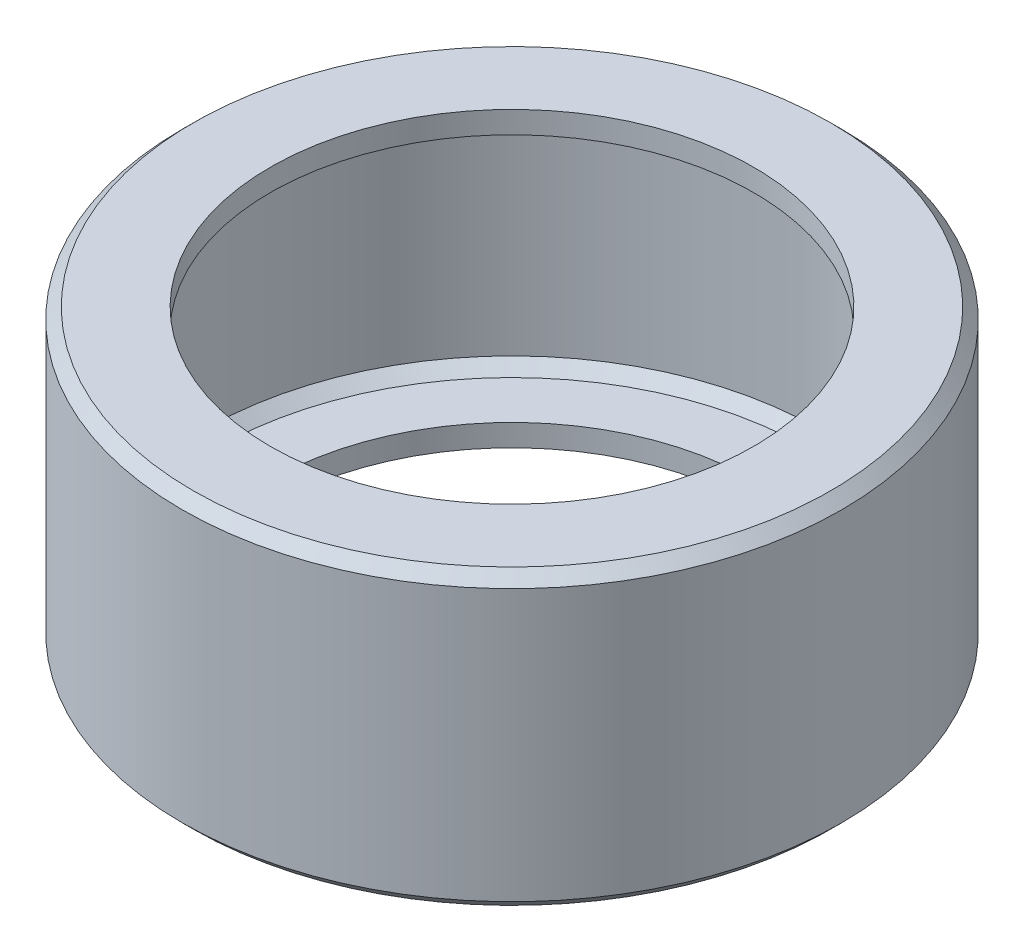
ISO-10303-21;
HEADER;
FILE_DESCRIPTION(('STEP AP214'),'2;1');
FILE_NAME('part.step','',(''),(''),'','','');
FILE_SCHEMA(('AUTOMOTIVE_DESIGN { 1 0 10303 214 1 1 1 1 }'));
ENDSEC;
DATA;
#1=APPLICATION_CONTEXT('core data for automotive mechanical design processes');
#2=APPLICATION_PROTOCOL_DEFINITION('international standard','automotive_design',2000,#1);
#3=PRODUCT_CONTEXT('',#1,'mechanical');
#4=PRODUCT('Part','Part','',(#3));
#5=PRODUCT_RELATED_PRODUCT_CATEGORY('part','',(#4));
#6=PRODUCT_DEFINITION_FORMATION('','',#4);
#7=PRODUCT_DEFINITION_CONTEXT('part definition',#1,'design');
#8=PRODUCT_DEFINITION('design','',#6,#7);
#9=PRODUCT_DEFINITION_SHAPE('','',#8);
#10=(LENGTH_UNIT() NAMED_UNIT(*) SI_UNIT(.MILLI.,.METRE.));
#11=(NAMED_UNIT(*) PLANE_ANGLE_UNIT() SI_UNIT($,.RADIAN.));
#12=(NAMED_UNIT(*) SI_UNIT($,.STERADIAN.) SOLID_ANGLE_UNIT());
#13=UNCERTAINTY_MEASURE_WITH_UNIT(LENGTH_MEASURE(1.E-05),#10,'distance_accuracy_value','');
#14=(GEOMETRIC_REPRESENTATION_CONTEXT(3) GLOBAL_UNCERTAINTY_ASSIGNED_CONTEXT((#13)) GLOBAL_UNIT_ASSIGNED_CONTEXT((#10,
#11,#12)) REPRESENTATION_CONTEXT('',''));
#15=CARTESIAN_POINT('',(0.,0.,0.));
#16=DIRECTION('',(0.,0.,1.));
#17=DIRECTION('',(1.,0.,0.));
#18=AXIS2_PLACEMENT_3D('',#15,#16,#17);
#19=CARTESIAN_POINT('',(0.,1.7,0.));
#20=DIRECTION('',(0.,-1.,0.));
#21=DIRECTION('',(0.,0.,-1.));
#22=AXIS2_PLACEMENT_3D('',#19,#20,#21);
#23=CYLINDRICAL_SURFACE('',#22,4.5);
#24=CARTESIAN_POINT('',(0.,1.85,0.));
#25=DIRECTION('',(0.,1.,0.));
#26=DIRECTION('',(0.,0.,1.));
#27=AXIS2_PLACEMENT_3D('',#24,#25,#26);
#28=CIRCLE('',#27,4.5);
#29=CARTESIAN_POINT('',(0.,1.85,4.5));
#30=VERTEX_POINT('',#29);
#31=EDGE_CURVE('E43',#30,#30,#28,.F.);
#32=ORIENTED_EDGE('',*,*,#31,.T.);
#33=EDGE_LOOP('',(#32));
#34=FACE_BOUND('',#33,.T.);
#35=CARTESIAN_POINT('',(0.,-1.85,0.));
#36=DIRECTION('',(0.,1.,0.));
#37=DIRECTION('',(0.,0.,1.));
#38=AXIS2_PLACEMENT_3D('',#35,#36,#37);
#39=CIRCLE('',#38,4.5);
#40=CARTESIAN_POINT('',(0.,-1.85,4.5));
#41=VERTEX_POINT('',#40);
#42=EDGE_CURVE('E64',#41,#41,#39,.F.);
#43=ORIENTED_EDGE('',*,*,#42,.F.);
#44=EDGE_LOOP('',(#43));
#45=FACE_BOUND('',#44,.T.);
#46=ADVANCED_FACE('F32',(#34,#45),#23,.T.);
#47=CARTESIAN_POINT('',(0.,1.7,0.));
#48=DIRECTION('',(0.,-1.,0.));
#49=DIRECTION('',(0.,0.,-1.));
#50=AXIS2_PLACEMENT_3D('',#47,#48,#49);
#51=CYLINDRICAL_SURFACE('',#50,4.2);
#52=CARTESIAN_POINT('',(0.,1.55,0.));
#53=DIRECTION('',(0.,1.,0.));
#54=DIRECTION('',(0.,0.,1.));
#55=AXIS2_PLACEMENT_3D('',#52,#53,#54);
#56=CIRCLE('',#55,4.2);
#57=CARTESIAN_POINT('',(0.,1.55,-4.2));
#58=VERTEX_POINT('',#57);
#59=EDGE_CURVE('E39',#58,#58,#56,.T.);
#60=CARTESIAN_POINT('',(0.,-1.55,0.));
#61=DIRECTION('',(0.,1.,0.));
#62=DIRECTION('',(0.,0.,1.));
#63=AXIS2_PLACEMENT_3D('',#60,#61,#62);
#64=CIRCLE('',#63,4.2);
#65=CARTESIAN_POINT('',(0.,-1.55,-4.2));
#66=VERTEX_POINT('',#65);
#67=EDGE_CURVE('E61',#66,#66,#64,.T.);
#68=CARTESIAN_POINT('',(0.,1.55,-4.2));
#69=CARTESIAN_POINT('',(0.,1.51770833333333,-4.2));
#70=CARTESIAN_POINT('',(0.,1.48541666666666,-4.2));
#71=CARTESIAN_POINT('',(0.,1.42083333333333,-4.2));
#72=CARTESIAN_POINT('',(0.,1.38854166666666,-4.2));
#73=CARTESIAN_POINT('',(0.,1.32395833333333,-4.2));
#74=CARTESIAN_POINT('',(0.,1.29166666666666,-4.2));
#75=CARTESIAN_POINT('',(0.,1.22708333333333,-4.2));
#76=CARTESIAN_POINT('',(0.,1.19479166666666,-4.2));
#77=CARTESIAN_POINT('',(0.,1.13020833333333,-4.2));
#78=CARTESIAN_POINT('',(0.,1.09791666666666,-4.2));
#79=CARTESIAN_POINT('',(0.,1.03333333333333,-4.2));
#80=CARTESIAN_POINT('',(0.,1.00104166666666,-4.2));
#81=CARTESIAN_POINT('',(0.,0.936458333333332,-4.2));
#82=CARTESIAN_POINT('',(0.,0.904166666666665,-4.2));
#83=CARTESIAN_POINT('',(0.,0.839583333333332,-4.2));
#84=CARTESIAN_POINT('',(0.,0.807291666666665,-4.2));
#85=CARTESIAN_POINT('',(0.,0.742708333333332,-4.2));
#86=CARTESIAN_POINT('',(0.,0.710416666666665,-4.2));
#87=CARTESIAN_POINT('',(0.,0.645833333333332,-4.2));
#88=CARTESIAN_POINT('',(0.,0.613541666666665,-4.2));
#89=CARTESIAN_POINT('',(0.,0.548958333333332,-4.2));
#90=CARTESIAN_POINT('',(0.,0.516666666666665,-4.2));
#91=CARTESIAN_POINT('',(0.,0.452083333333332,-4.2));
#92=CARTESIAN_POINT('',(0.,0.419791666666666,-4.2));
#93=CARTESIAN_POINT('',(0.,0.355208333333333,-4.2));
#94=CARTESIAN_POINT('',(0.,0.322916666666666,-4.2));
#95=CARTESIAN_POINT('',(0.,0.258333333333333,-4.2));
#96=CARTESIAN_POINT('',(0.,0.226041666666666,-4.2));
#97=CARTESIAN_POINT('',(0.,0.161458333333333,-4.2));
#98=CARTESIAN_POINT('',(0.,0.129166666666666,-4.2));
#99=CARTESIAN_POINT('',(0.,0.0645833333333329,-4.2));
#100=CARTESIAN_POINT('',(0.,0.0322916666666664,-4.2));
#101=CARTESIAN_POINT('',(0.,-0.0322916666666668,-4.2));
#102=CARTESIAN_POINT('',(0.,-0.0645833333333334,-4.2));
#103=CARTESIAN_POINT('',(0.,-0.129166666666667,-4.2));
#104=CARTESIAN_POINT('',(0.,-0.161458333333333,-4.2));
#105=CARTESIAN_POINT('',(0.,-0.226041666666667,-4.2));
#106=CARTESIAN_POINT('',(0.,-0.258333333333333,-4.2));
#107=CARTESIAN_POINT('',(0.,-0.322916666666666,-4.2));
#108=CARTESIAN_POINT('',(0.,-0.355208333333333,-4.2));
#109=CARTESIAN_POINT('',(0.,-0.419791666666666,-4.2));
#110=CARTESIAN_POINT('',(0.,-0.452083333333333,-4.2));
#111=CARTESIAN_POINT('',(0.,-0.516666666666666,-4.2));
#112=CARTESIAN_POINT('',(0.,-0.548958333333333,-4.2));
#113=CARTESIAN_POINT('',(0.,-0.613541666666666,-4.2));
#114=CARTESIAN_POINT('',(0.,-0.645833333333333,-4.2));
#115=CARTESIAN_POINT('',(0.,-0.710416666666666,-4.2));
#116=CARTESIAN_POINT('',(0.,-0.742708333333332,-4.2));
#117=CARTESIAN_POINT('',(0.,-0.807291666666666,-4.2));
#118=CARTESIAN_POINT('',(0.,-0.839583333333332,-4.2));
#119=CARTESIAN_POINT('',(0.,-0.904166666666665,-4.2));
#120=CARTESIAN_POINT('',(0.,-0.936458333333332,-4.2));
#121=CARTESIAN_POINT('',(0.,-1.00104166666667,-4.2));
#122=CARTESIAN_POINT('',(0.,-1.03333333333333,-4.2));
#123=CARTESIAN_POINT('',(0.,-1.09791666666667,-4.2));
#124=CARTESIAN_POINT('',(0.,-1.13020833333333,-4.2));
#125=CARTESIAN_POINT('',(0.,-1.19479166666666,-4.2));
#126=CARTESIAN_POINT('',(0.,-1.22708333333333,-4.2));
#127=CARTESIAN_POINT('',(0.,-1.29166666666666,-4.2));
#128=CARTESIAN_POINT('',(0.,-1.32395833333333,-4.2));
#129=CARTESIAN_POINT('',(0.,-1.38854166666666,-4.2));
#130=CARTESIAN_POINT('',(0.,-1.42083333333333,-4.2));
#131=CARTESIAN_POINT('',(0.,-1.48541666666666,-4.2));
#132=CARTESIAN_POINT('',(0.,-1.51770833333333,-4.2));
#133=CARTESIAN_POINT('',(0.,-1.55,-4.2));
#134=B_SPLINE_CURVE_WITH_KNOTS('',3,(#68,#69,#70,#71,#72,#73,#74,#75,#76,#77,#78,#79,#80,#81,
#82,#83,#84,#85,#86,#87,#88,#89,#90,#91,#92,#93,#94,#95,#96,#97,#98,#99,#100,#101,#102,#103,
#104,#105,#106,#107,#108,#109,#110,#111,#112,#113,#114,#115,#116,#117,#118,#119,#120,#121,#122,
#123,#124,#125,#126,#127,#128,#129,#130,#131,#132,#133),.UNSPECIFIED.,.F.,.F.,(4,2,2,2,2,2,2,2,
2,2,2,2,2,2,2,2,2,2,2,2,2,2,2,2,2,2,2,2,2,2,2,2,4),(0.,0.0968749999999997,0.193749999999999,
0.290624999999999,0.387499999999999,0.484374999999999,0.581249999999999,0.678124999999999,
0.774999999999999,0.871874999999999,0.968749999999998,1.065625,1.1625,1.259375,1.35625,1.453125,
1.55,1.646875,1.74375,1.840625,1.9375,2.034375,2.13125,2.228125,2.325,2.421875,2.51875,2.615625,
2.7125,2.80937499999999,2.90625,3.00312499999999,3.09999999999999),.UNSPECIFIED.);
#135=EDGE_CURVE('BSEAM101',#58,#66,#134,.T.);
#136=ORIENTED_EDGE('',*,*,#59,.T.);
#137=ORIENTED_EDGE('',*,*,#67,.F.);
#138=ORIENTED_EDGE('',*,*,#135,.T.);
#139=ORIENTED_EDGE('',*,*,#135,.F.);
#140=EDGE_LOOP('',(#136,#138,#137,#139));
#141=FACE_BOUND('',#140,.T.);
#142=ADVANCED_FACE('F101',(#141),#51,.F.);
#143=CARTESIAN_POINT('',(0.,1.7,0.));
#144=DIRECTION('',(0.,1.,0.));
#145=DIRECTION('',(0.,0.,1.));
#146=AXIS2_PLACEMENT_3D('',#143,#144,#145);
#147=PLANE('',#146);
#148=CARTESIAN_POINT('',(0.,1.7,0.));
#149=DIRECTION('',(0.,1.,0.));
#150=DIRECTION('',(0.,0.,1.));
#151=AXIS2_PLACEMENT_3D('',#148,#149,#150);
#152=CIRCLE('',#151,4.05);
#153=CARTESIAN_POINT('',(0.,1.7,-4.05));
#154=VERTEX_POINT('',#153);
#155=EDGE_CURVE('E10',#154,#154,#152,.F.);
#156=ORIENTED_EDGE('',*,*,#155,.T.);
#157=EDGE_LOOP('',(#156));
#158=FACE_BOUND('',#157,.T.);
#159=CARTESIAN_POINT('',(0.,1.7,0.));
#160=DIRECTION('',(0.,1.,0.));
#161=DIRECTION('',(0.,0.,1.));
#162=AXIS2_PLACEMENT_3D('',#159,#160,#161);
#163=CIRCLE('',#162,3.3);
#164=CARTESIAN_POINT('',(0.,1.7,3.3));
#165=VERTEX_POINT('',#164);
#166=EDGE_CURVE('E53',#165,#165,#163,.T.);
#167=ORIENTED_EDGE('',*,*,#166,.T.);
#168=EDGE_LOOP('',(#167));
#169=FACE_BOUND('',#168,.T.);
#170=ADVANCED_FACE('F107',(#158,#169),#147,.F.);
#171=CARTESIAN_POINT('',(0.,2.,0.));
#172=DIRECTION('',(0.,1.,0.));
#173=DIRECTION('',(0.,0.,1.));
#174=AXIS2_PLACEMENT_3D('',#171,#172,#173);
#175=PLANE('',#174);
#176=CARTESIAN_POINT('',(0.,2.,0.));
#177=DIRECTION('',(0.,1.,0.));
#178=DIRECTION('',(0.,0.,1.));
#179=AXIS2_PLACEMENT_3D('',#176,#177,#178);
#180=CIRCLE('',#179,4.35);
#181=CARTESIAN_POINT('',(0.,2.,4.35));
#182=VERTEX_POINT('',#181);
#183=EDGE_CURVE('E47',#182,#182,#180,.T.);
#184=ORIENTED_EDGE('',*,*,#183,.T.);
#185=EDGE_LOOP('',(#184));
#186=FACE_BOUND('',#185,.T.);
#187=CARTESIAN_POINT('',(0.,2.,0.));
#188=DIRECTION('',(0.,1.,0.));
#189=DIRECTION('',(0.,0.,1.));
#190=AXIS2_PLACEMENT_3D('',#187,#188,#189);
#191=CIRCLE('',#190,3.3);
#192=CARTESIAN_POINT('',(0.,2.,3.3));
#193=VERTEX_POINT('',#192);
#194=EDGE_CURVE('E52',#193,#193,#191,.T.);
#195=ORIENTED_EDGE('',*,*,#194,.F.);
#196=EDGE_LOOP('',(#195));
#197=FACE_BOUND('',#196,.T.);
#198=ADVANCED_FACE('F117',(#186,#197),#175,.T.);
#199=CARTESIAN_POINT('',(0.,2.,0.));
#200=DIRECTION('',(0.,-1.,0.));
#201=DIRECTION('',(0.,0.,-1.));
#202=AXIS2_PLACEMENT_3D('',#199,#200,#201);
#203=CYLINDRICAL_SURFACE('',#202,3.3);
#204=ORIENTED_EDGE('',*,*,#194,.T.);
#205=EDGE_LOOP('',(#204));
#206=FACE_BOUND('',#205,.T.);
#207=ORIENTED_EDGE('',*,*,#166,.F.);
#208=EDGE_LOOP('',(#207));
#209=FACE_BOUND('',#208,.T.);
#210=ADVANCED_FACE('F112',(#206,#209),#203,.F.);
#211=CARTESIAN_POINT('',(0.,2.,0.));
#212=DIRECTION('',(0.,-1.,0.));
#213=DIRECTION('',(0.,0.,-1.));
#214=AXIS2_PLACEMENT_3D('',#211,#212,#213);
#215=CONICAL_SURFACE('',#214,4.35,0.785398163397448);
#216=ORIENTED_EDGE('',*,*,#31,.F.);
#217=EDGE_LOOP('',(#216));
#218=FACE_BOUND('',#217,.T.);
#219=ORIENTED_EDGE('',*,*,#183,.F.);
#220=EDGE_LOOP('',(#219));
#221=FACE_BOUND('',#220,.T.);
#222=ADVANCED_FACE('F96',(#218,#221),#215,.T.);
#223=CARTESIAN_POINT('',(0.,1.55,0.));
#224=DIRECTION('',(0.,-1.,0.));
#225=DIRECTION('',(0.,0.,-1.));
#226=AXIS2_PLACEMENT_3D('',#223,#224,#225);
#227=CONICAL_SURFACE('',#226,4.2,0.785398163397445);
#228=CARTESIAN_POINT('',(0.,1.7,-4.05));
#229=CARTESIAN_POINT('',(0.,1.6984375,-4.0515625));
#230=CARTESIAN_POINT('',(0.,1.696875,-4.053125));
#231=CARTESIAN_POINT('',(0.,1.69375,-4.05625));
#232=CARTESIAN_POINT('',(0.,1.6921875,-4.0578125));
#233=CARTESIAN_POINT('',(0.,1.6890625,-4.0609375));
#234=CARTESIAN_POINT('',(0.,1.6875,-4.0625));
#235=CARTESIAN_POINT('',(0.,1.684375,-4.065625));
#236=CARTESIAN_POINT('',(0.,1.6828125,-4.0671875));
#237=CARTESIAN_POINT('',(0.,1.6796875,-4.0703125));
#238=CARTESIAN_POINT('',(0.,1.678125,-4.071875));
#239=CARTESIAN_POINT('',(0.,1.675,-4.075));
#240=CARTESIAN_POINT('',(0.,1.6734375,-4.0765625));
#241=CARTESIAN_POINT('',(0.,1.6703125,-4.0796875));
#242=CARTESIAN_POINT('',(0.,1.66875,-4.08125));
#243=CARTESIAN_POINT('',(0.,1.665625,-4.084375));
#244=CARTESIAN_POINT('',(0.,1.6640625,-4.0859375));
#245=CARTESIAN_POINT('',(0.,1.6609375,-4.0890625));
#246=CARTESIAN_POINT('',(0.,1.659375,-4.090625));
#247=CARTESIAN_POINT('',(0.,1.65625,-4.09375));
#248=CARTESIAN_POINT('',(0.,1.6546875,-4.0953125));
#249=CARTESIAN_POINT('',(0.,1.6515625,-4.0984375));
#250=CARTESIAN_POINT('',(0.,1.65,-4.1));
#251=CARTESIAN_POINT('',(0.,1.646875,-4.103125));
#252=CARTESIAN_POINT('',(0.,1.6453125,-4.1046875));
#253=CARTESIAN_POINT('',(0.,1.6421875,-4.1078125));
#254=CARTESIAN_POINT('',(0.,1.640625,-4.109375));
#255=CARTESIAN_POINT('',(0.,1.6375,-4.1125));
#256=CARTESIAN_POINT('',(0.,1.6359375,-4.1140625));
#257=CARTESIAN_POINT('',(0.,1.6328125,-4.1171875));
#258=CARTESIAN_POINT('',(0.,1.63125,-4.11875));
#259=CARTESIAN_POINT('',(0.,1.628125,-4.121875));
#260=CARTESIAN_POINT('',(0.,1.6265625,-4.1234375));
#261=CARTESIAN_POINT('',(0.,1.6234375,-4.1265625));
#262=CARTESIAN_POINT('',(0.,1.621875,-4.128125));
#263=CARTESIAN_POINT('',(0.,1.61875,-4.13125));
#264=CARTESIAN_POINT('',(0.,1.6171875,-4.1328125));
#265=CARTESIAN_POINT('',(0.,1.6140625,-4.1359375));
#266=CARTESIAN_POINT('',(0.,1.6125,-4.1375));
#267=CARTESIAN_POINT('',(0.,1.609375,-4.140625));
#268=CARTESIAN_POINT('',(0.,1.6078125,-4.1421875));
#269=CARTESIAN_POINT('',(0.,1.6046875,-4.1453125));
#270=CARTESIAN_POINT('',(0.,1.603125,-4.146875));
#271=CARTESIAN_POINT('',(0.,1.6,-4.15));
#272=CARTESIAN_POINT('',(0.,1.5984375,-4.1515625));
#273=CARTESIAN_POINT('',(0.,1.5953125,-4.1546875));
#274=CARTESIAN_POINT('',(0.,1.59375,-4.15625));
#275=CARTESIAN_POINT('',(0.,1.590625,-4.159375));
#276=CARTESIAN_POINT('',(0.,1.5890625,-4.1609375));
#277=CARTESIAN_POINT('',(0.,1.5859375,-4.1640625));
#278=CARTESIAN_POINT('',(0.,1.584375,-4.165625));
#279=CARTESIAN_POINT('',(0.,1.58125,-4.16875));
#280=CARTESIAN_POINT('',(0.,1.5796875,-4.1703125));
#281=CARTESIAN_POINT('',(0.,1.5765625,-4.1734375));
#282=CARTESIAN_POINT('',(0.,1.575,-4.175));
#283=CARTESIAN_POINT('',(0.,1.571875,-4.178125));
#284=CARTESIAN_POINT('',(0.,1.5703125,-4.1796875));
#285=CARTESIAN_POINT('',(0.,1.5671875,-4.1828125));
#286=CARTESIAN_POINT('',(0.,1.565625,-4.184375));
#287=CARTESIAN_POINT('',(0.,1.5625,-4.1875));
#288=CARTESIAN_POINT('',(0.,1.5609375,-4.1890625));
#289=CARTESIAN_POINT('',(0.,1.5578125,-4.1921875));
#290=CARTESIAN_POINT('',(0.,1.55625,-4.19375));
#291=CARTESIAN_POINT('',(0.,1.553125,-4.196875));
#292=CARTESIAN_POINT('',(0.,1.5515625,-4.1984375));
#293=CARTESIAN_POINT('',(0.,1.55,-4.2));
#294=B_SPLINE_CURVE_WITH_KNOTS('',3,(#228,#229,#230,#231,#232,#233,#234,#235,#236,#237,#238,
#239,#240,#241,#242,#243,#244,#245,#246,#247,#248,#249,#250,#251,#252,#253,#254,#255,#256,#257,
#258,#259,#260,#261,#262,#263,#264,#265,#266,#267,#268,#269,#270,#271,#272,#273,#274,#275,#276,
#277,#278,#279,#280,#281,#282,#283,#284,#285,#286,#287,#288,#289,#290,#291,#292,#293),
.UNSPECIFIED.,.F.,.F.,(4,2,2,2,2,2,2,2,2,2,2,2,2,2,2,2,2,2,2,2,2,2,2,2,2,2,2,2,2,2,2,2,4),(0.,
0.00662912607362423,0.0132582521472478,0.0198873782208721,0.0265165042944961,0.0331456303681198,
0.039774756441744,0.0464038825153682,0.0530330085889917,0.0596621346626159,0.0662912607362401,
0.0729203868098637,0.0795495128834878,0.086178638957112,0.0928077650307356,0.0994368911043599,
0.106066017177984,0.112695143251608,0.119324269325232,0.125953395398856,0.132582521472479,
0.139211647546104,0.145840773619728,0.152469899693352,0.159099025766976,0.1657281518406,
0.172357277914223,0.178986403987848,0.185615530061471,0.192244656135095,0.19887378220872,
0.205502908282343,0.212132034355967),.UNSPECIFIED.);
#295=EDGE_CURVE('BSEAM34',#154,#58,#294,.T.);
#296=ORIENTED_EDGE('',*,*,#155,.F.);
#297=ORIENTED_EDGE('',*,*,#59,.F.);
#298=ORIENTED_EDGE('',*,*,#295,.T.);
#299=ORIENTED_EDGE('',*,*,#295,.F.);
#300=EDGE_LOOP('',(#296,#298,#297,#299));
#301=FACE_BOUND('',#300,.T.);
#302=ADVANCED_FACE('F34',(#301),#227,.F.);
#303=CARTESIAN_POINT('',(0.,-1.7,0.));
#304=DIRECTION('',(0.,-1.,0.));
#305=DIRECTION('',(0.,0.,1.));
#306=AXIS2_PLACEMENT_3D('',#303,#304,#305);
#307=PLANE('',#306);
#308=CARTESIAN_POINT('',(0.,-1.7,0.));
#309=DIRECTION('',(0.,1.,0.));
#310=DIRECTION('',(0.,0.,1.));
#311=AXIS2_PLACEMENT_3D('',#308,#309,#310);
#312=CIRCLE('',#311,4.05);
#313=CARTESIAN_POINT('',(0.,-1.7,-4.05));
#314=VERTEX_POINT('',#313);
#315=EDGE_CURVE('E56',#314,#314,#312,.F.);
#316=ORIENTED_EDGE('',*,*,#315,.F.);
#317=EDGE_LOOP('',(#316));
#318=FACE_BOUND('',#317,.T.);
#319=CARTESIAN_POINT('',(0.,-1.7,0.));
#320=DIRECTION('',(0.,1.,0.));
#321=DIRECTION('',(0.,0.,1.));
#322=AXIS2_PLACEMENT_3D('',#319,#320,#321);
#323=CIRCLE('',#322,3.3);
#324=CARTESIAN_POINT('',(0.,-1.7,3.3));
#325=VERTEX_POINT('',#324);
#326=EDGE_CURVE('E71',#325,#325,#323,.T.);
#327=ORIENTED_EDGE('',*,*,#326,.F.);
#328=EDGE_LOOP('',(#327));
#329=FACE_BOUND('',#328,.T.);
#330=ADVANCED_FACE('F86',(#318,#329),#307,.F.);
#331=CARTESIAN_POINT('',(0.,-2.,0.));
#332=DIRECTION('',(0.,-1.,0.));
#333=DIRECTION('',(0.,0.,1.));
#334=AXIS2_PLACEMENT_3D('',#331,#332,#333);
#335=PLANE('',#334);
#336=CARTESIAN_POINT('',(0.,-2.,0.));
#337=DIRECTION('',(0.,1.,0.));
#338=DIRECTION('',(0.,0.,1.));
#339=AXIS2_PLACEMENT_3D('',#336,#337,#338);
#340=CIRCLE('',#339,4.35);
#341=CARTESIAN_POINT('',(0.,-2.,4.35));
#342=VERTEX_POINT('',#341);
#343=EDGE_CURVE('E67',#342,#342,#340,.T.);
#344=ORIENTED_EDGE('',*,*,#343,.F.);
#345=EDGE_LOOP('',(#344));
#346=FACE_BOUND('',#345,.T.);
#347=CARTESIAN_POINT('',(0.,-2.,0.));
#348=DIRECTION('',(0.,1.,0.));
#349=DIRECTION('',(0.,0.,1.));
#350=AXIS2_PLACEMENT_3D('',#347,#348,#349);
#351=CIRCLE('',#350,3.3);
#352=CARTESIAN_POINT('',(0.,-2.,3.3));
#353=VERTEX_POINT('',#352);
#354=EDGE_CURVE('E70',#353,#353,#351,.T.);
#355=ORIENTED_EDGE('',*,*,#354,.T.);
#356=EDGE_LOOP('',(#355));
#357=FACE_BOUND('',#356,.T.);
#358=ADVANCED_FACE('F77',(#346,#357),#335,.T.);
#359=CARTESIAN_POINT('',(0.,-2.,0.));
#360=DIRECTION('',(0.,1.,0.));
#361=DIRECTION('',(0.,0.,-1.));
#362=AXIS2_PLACEMENT_3D('',#359,#360,#361);
#363=CYLINDRICAL_SURFACE('',#362,3.3);
#364=ORIENTED_EDGE('',*,*,#354,.F.);
#365=EDGE_LOOP('',(#364));
#366=FACE_BOUND('',#365,.T.);
#367=ORIENTED_EDGE('',*,*,#326,.T.);
#368=EDGE_LOOP('',(#367));
#369=FACE_BOUND('',#368,.T.);
#370=ADVANCED_FACE('F79',(#366,#369),#363,.F.);
#371=CARTESIAN_POINT('',(0.,-2.,0.));
#372=DIRECTION('',(0.,1.,0.));
#373=DIRECTION('',(0.,0.,-1.));
#374=AXIS2_PLACEMENT_3D('',#371,#372,#373);
#375=CONICAL_SURFACE('',#374,4.35,0.785398163397448);
#376=ORIENTED_EDGE('',*,*,#42,.T.);
#377=EDGE_LOOP('',(#376));
#378=FACE_BOUND('',#377,.T.);
#379=ORIENTED_EDGE('',*,*,#343,.T.);
#380=EDGE_LOOP('',(#379));
#381=FACE_BOUND('',#380,.T.);
#382=ADVANCED_FACE('F82',(#378,#381),#375,.T.);
#383=CARTESIAN_POINT('',(0.,-1.55,0.));
#384=DIRECTION('',(0.,1.,0.));
#385=DIRECTION('',(0.,0.,-1.));
#386=AXIS2_PLACEMENT_3D('',#383,#384,#385);
#387=CONICAL_SURFACE('',#386,4.2,0.785398163397445);
#388=CARTESIAN_POINT('',(0.,-1.7,-4.05));
#389=CARTESIAN_POINT('',(0.,-1.6984375,-4.0515625));
#390=CARTESIAN_POINT('',(0.,-1.696875,-4.053125));
#391=CARTESIAN_POINT('',(0.,-1.69375,-4.05625));
#392=CARTESIAN_POINT('',(0.,-1.6921875,-4.0578125));
#393=CARTESIAN_POINT('',(0.,-1.6890625,-4.0609375));
#394=CARTESIAN_POINT('',(0.,-1.6875,-4.0625));
#395=CARTESIAN_POINT('',(0.,-1.684375,-4.065625));
#396=CARTESIAN_POINT('',(0.,-1.6828125,-4.0671875));
#397=CARTESIAN_POINT('',(0.,-1.6796875,-4.0703125));
#398=CARTESIAN_POINT('',(0.,-1.678125,-4.071875));
#399=CARTESIAN_POINT('',(0.,-1.675,-4.075));
#400=CARTESIAN_POINT('',(0.,-1.6734375,-4.0765625));
#401=CARTESIAN_POINT('',(0.,-1.6703125,-4.0796875));
#402=CARTESIAN_POINT('',(0.,-1.66875,-4.08125));
#403=CARTESIAN_POINT('',(0.,-1.665625,-4.084375));
#404=CARTESIAN_POINT('',(0.,-1.6640625,-4.0859375));
#405=CARTESIAN_POINT('',(0.,-1.6609375,-4.0890625));
#406=CARTESIAN_POINT('',(0.,-1.659375,-4.090625));
#407=CARTESIAN_POINT('',(0.,-1.65625,-4.09375));
#408=CARTESIAN_POINT('',(0.,-1.6546875,-4.0953125));
#409=CARTESIAN_POINT('',(0.,-1.6515625,-4.0984375));
#410=CARTESIAN_POINT('',(0.,-1.65,-4.1));
#411=CARTESIAN_POINT('',(0.,-1.646875,-4.103125));
#412=CARTESIAN_POINT('',(0.,-1.6453125,-4.1046875));
#413=CARTESIAN_POINT('',(0.,-1.6421875,-4.1078125));
#414=CARTESIAN_POINT('',(0.,-1.640625,-4.109375));
#415=CARTESIAN_POINT('',(0.,-1.6375,-4.1125));
#416=CARTESIAN_POINT('',(0.,-1.6359375,-4.1140625));
#417=CARTESIAN_POINT('',(0.,-1.6328125,-4.1171875));
#418=CARTESIAN_POINT('',(0.,-1.63125,-4.11875));
#419=CARTESIAN_POINT('',(0.,-1.628125,-4.121875));
#420=CARTESIAN_POINT('',(0.,-1.6265625,-4.1234375));
#421=CARTESIAN_POINT('',(0.,-1.6234375,-4.1265625));
#422=CARTESIAN_POINT('',(0.,-1.621875,-4.128125));
#423=CARTESIAN_POINT('',(0.,-1.61875,-4.13125));
#424=CARTESIAN_POINT('',(0.,-1.6171875,-4.1328125));
#425=CARTESIAN_POINT('',(0.,-1.6140625,-4.1359375));
#426=CARTESIAN_POINT('',(0.,-1.6125,-4.1375));
#427=CARTESIAN_POINT('',(0.,-1.609375,-4.140625));
#428=CARTESIAN_POINT('',(0.,-1.6078125,-4.1421875));
#429=CARTESIAN_POINT('',(0.,-1.6046875,-4.1453125));
#430=CARTESIAN_POINT('',(0.,-1.603125,-4.146875));
#431=CARTESIAN_POINT('',(0.,-1.6,-4.15));
#432=CARTESIAN_POINT('',(0.,-1.5984375,-4.1515625));
#433=CARTESIAN_POINT('',(0.,-1.5953125,-4.1546875));
#434=CARTESIAN_POINT('',(0.,-1.59375,-4.15625));
#435=CARTESIAN_POINT('',(0.,-1.590625,-4.159375));
#436=CARTESIAN_POINT('',(0.,-1.5890625,-4.1609375));
#437=CARTESIAN_POINT('',(0.,-1.5859375,-4.1640625));
#438=CARTESIAN_POINT('',(0.,-1.584375,-4.165625));
#439=CARTESIAN_POINT('',(0.,-1.58125,-4.16875));
#440=CARTESIAN_POINT('',(0.,-1.5796875,-4.1703125));
#441=CARTESIAN_POINT('',(0.,-1.5765625,-4.1734375));
#442=CARTESIAN_POINT('',(0.,-1.575,-4.175));
#443=CARTESIAN_POINT('',(0.,-1.571875,-4.178125));
#444=CARTESIAN_POINT('',(0.,-1.5703125,-4.1796875));
#445=CARTESIAN_POINT('',(0.,-1.5671875,-4.1828125));
#446=CARTESIAN_POINT('',(0.,-1.565625,-4.184375));
#447=CARTESIAN_POINT('',(0.,-1.5625,-4.1875));
#448=CARTESIAN_POINT('',(0.,-1.5609375,-4.1890625));
#449=CARTESIAN_POINT('',(0.,-1.5578125,-4.1921875));
#450=CARTESIAN_POINT('',(0.,-1.55625,-4.19375));
#451=CARTESIAN_POINT('',(0.,-1.553125,-4.196875));
#452=CARTESIAN_POINT('',(0.,-1.5515625,-4.1984375));
#453=CARTESIAN_POINT('',(0.,-1.55,-4.2));
#454=B_SPLINE_CURVE_WITH_KNOTS('',3,(#388,#389,#390,#391,#392,#393,#394,#395,#396,#397,#398,
#399,#400,#401,#402,#403,#404,#405,#406,#407,#408,#409,#410,#411,#412,#413,#414,#415,#416,#417,
#418,#419,#420,#421,#422,#423,#424,#425,#426,#427,#428,#429,#430,#431,#432,#433,#434,#435,#436,
#437,#438,#439,#440,#441,#442,#443,#444,#445,#446,#447,#448,#449,#450,#451,#452,#453),
.UNSPECIFIED.,.F.,.F.,(4,2,2,2,2,2,2,2,2,2,2,2,2,2,2,2,2,2,2,2,2,2,2,2,2,2,2,2,2,2,2,2,4),(0.,
0.00662912607362407,0.0132582521472477,0.0198873782208719,0.0265165042944955,0.0331456303681196,
0.0397747564417438,0.0464038825153674,0.0530330085889917,0.0596621346626157,0.0662912607362394,
0.0729203868098636,0.0795495128834878,0.0861786389571113,0.0928077650307355,0.0994368911043597,
0.106066017177983,0.112695143251607,0.119324269325232,0.125953395398855,0.132582521472479,
0.139211647546104,0.145840773619727,0.152469899693351,0.159099025766976,0.165728151840599,
0.172357277914223,0.178986403987847,0.185615530061471,0.192244656135095,0.198873782208719,
0.205502908282343,0.212132034355967),.UNSPECIFIED.);
#455=EDGE_CURVE('BSEAM135',#314,#66,#454,.T.);
#456=ORIENTED_EDGE('',*,*,#315,.T.);
#457=ORIENTED_EDGE('',*,*,#67,.T.);
#458=ORIENTED_EDGE('',*,*,#455,.T.);
#459=ORIENTED_EDGE('',*,*,#455,.F.);
#460=EDGE_LOOP('',(#456,#458,#457,#459));
#461=FACE_BOUND('',#460,.T.);
#462=ADVANCED_FACE('F135',(#461),#387,.F.);
#463=CLOSED_SHELL('',(#46,#142,#170,#198,#210,#222,#302,#330,#358,#370,#382,#462));
#464=MANIFOLD_SOLID_BREP('B2',#463);
#465=ADVANCED_BREP_SHAPE_REPRESENTATION('',(#18,#464),#14);
#466=SHAPE_DEFINITION_REPRESENTATION(#9,#465);
ENDSEC;
END-ISO-10303-21;
